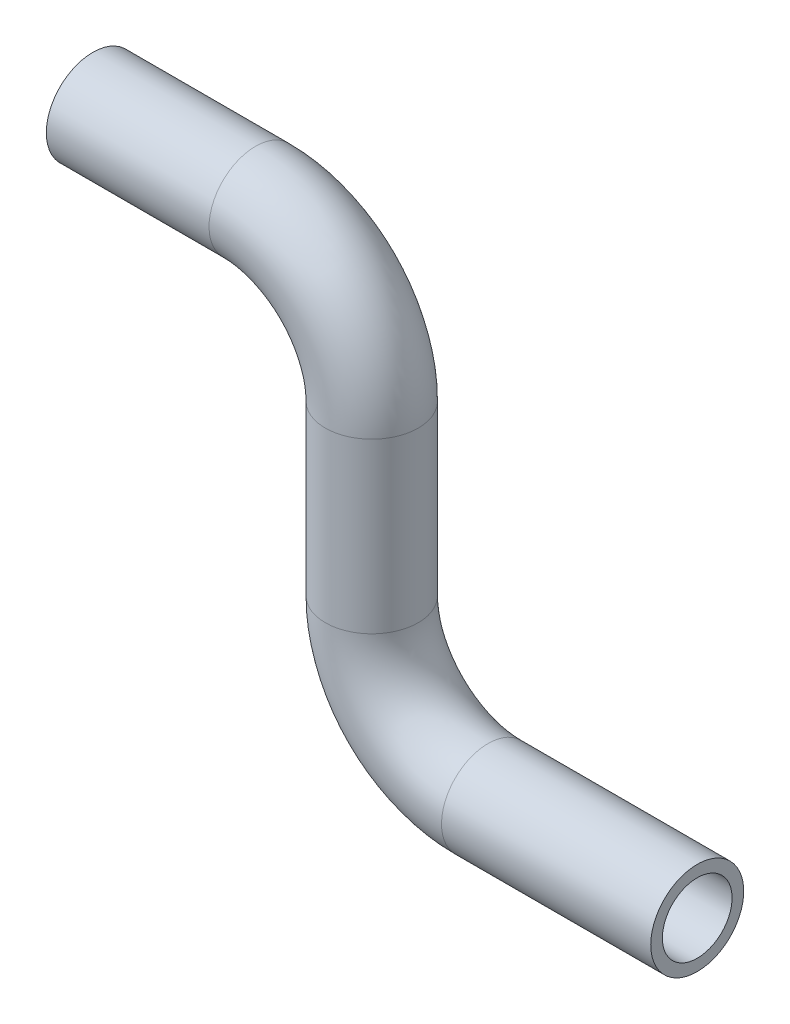
ISO-10303-21;
HEADER;
FILE_DESCRIPTION(('STEP AP214'),'2;1');
FILE_NAME('part.step','',(''),(''),'','','');
FILE_SCHEMA(('AUTOMOTIVE_DESIGN { 1 0 10303 214 1 1 1 1 }'));
ENDSEC;
DATA;
#1=APPLICATION_CONTEXT('core data for automotive mechanical design processes');
#2=APPLICATION_PROTOCOL_DEFINITION('international standard','automotive_design',2000,#1);
#3=PRODUCT_CONTEXT('',#1,'mechanical');
#4=PRODUCT('Part','Part','',(#3));
#5=PRODUCT_RELATED_PRODUCT_CATEGORY('part','',(#4));
#6=PRODUCT_DEFINITION_FORMATION('','',#4);
#7=PRODUCT_DEFINITION_CONTEXT('part definition',#1,'design');
#8=PRODUCT_DEFINITION('design','',#6,#7);
#9=PRODUCT_DEFINITION_SHAPE('','',#8);
#10=(LENGTH_UNIT() NAMED_UNIT(*) SI_UNIT(.MILLI.,.METRE.));
#11=(NAMED_UNIT(*) PLANE_ANGLE_UNIT() SI_UNIT($,.RADIAN.));
#12=(NAMED_UNIT(*) SI_UNIT($,.STERADIAN.) SOLID_ANGLE_UNIT());
#13=UNCERTAINTY_MEASURE_WITH_UNIT(LENGTH_MEASURE(1.E-05),#10,'distance_accuracy_value','');
#14=(GEOMETRIC_REPRESENTATION_CONTEXT(3) GLOBAL_UNCERTAINTY_ASSIGNED_CONTEXT((#13)) GLOBAL_UNIT_ASSIGNED_CONTEXT((#10,
#11,#12)) REPRESENTATION_CONTEXT('',''));
#15=CARTESIAN_POINT('',(0.,0.,0.));
#16=DIRECTION('',(0.,0.,1.));
#17=DIRECTION('',(1.,0.,0.));
#18=AXIS2_PLACEMENT_3D('',#15,#16,#17);
#19=CARTESIAN_POINT('',(28.,55.5,95.));
#20=DIRECTION('',(-1.,0.,0.));
#21=DIRECTION('',(0.,0.,1.));
#22=AXIS2_PLACEMENT_3D('',#19,#20,#21);
#23=PLANE('',#22);
#24=CARTESIAN_POINT('',(28.,55.5,95.));
#25=DIRECTION('',(-1.,0.,0.));
#26=DIRECTION('',(0.,0.,1.));
#27=AXIS2_PLACEMENT_3D('',#24,#25,#26);
#28=CIRCLE('',#27,3.);
#29=CARTESIAN_POINT('',(28.,55.5,98.));
#30=VERTEX_POINT('',#29);
#31=EDGE_CURVE('E213',#30,#30,#28,.T.);
#32=ORIENTED_EDGE('',*,*,#31,.F.);
#33=EDGE_LOOP('',(#32));
#34=FACE_BOUND('',#33,.T.);
#35=CARTESIAN_POINT('',(28.,55.5,95.));
#36=DIRECTION('',(-1.,0.,0.));
#37=DIRECTION('',(0.,0.,1.));
#38=AXIS2_PLACEMENT_3D('',#35,#36,#37);
#39=CIRCLE('',#38,4.);
#40=CARTESIAN_POINT('',(28.,55.5,99.));
#41=VERTEX_POINT('',#40);
#42=EDGE_CURVE('E75',#41,#41,#39,.T.);
#43=ORIENTED_EDGE('',*,*,#42,.T.);
#44=EDGE_LOOP('',(#43));
#45=FACE_BOUND('',#44,.T.);
#46=ADVANCED_FACE('F52',(#34,#45),#23,.T.);
#47=CARTESIAN_POINT('',(80.,21.,95.));
#48=DIRECTION('',(-1.,0.,0.));
#49=DIRECTION('',(0.,0.,1.));
#50=AXIS2_PLACEMENT_3D('',#47,#48,#49);
#51=PLANE('',#50);
#52=CARTESIAN_POINT('',(80.,21.,95.));
#53=DIRECTION('',(-1.,0.,0.));
#54=DIRECTION('',(0.,0.,1.));
#55=AXIS2_PLACEMENT_3D('',#52,#53,#54);
#56=CIRCLE('',#55,3.);
#57=CARTESIAN_POINT('',(80.,21.,98.));
#58=VERTEX_POINT('',#57);
#59=EDGE_CURVE('E73',#58,#58,#56,.T.);
#60=ORIENTED_EDGE('',*,*,#59,.T.);
#61=EDGE_LOOP('',(#60));
#62=FACE_BOUND('',#61,.T.);
#63=CARTESIAN_POINT('',(80.,21.,95.));
#64=DIRECTION('',(-1.,0.,0.));
#65=DIRECTION('',(0.,0.,1.));
#66=AXIS2_PLACEMENT_3D('',#63,#64,#65);
#67=CIRCLE('',#66,4.);
#68=CARTESIAN_POINT('',(80.,21.,99.));
#69=VERTEX_POINT('',#68);
#70=EDGE_CURVE('E11',#69,#69,#67,.T.);
#71=ORIENTED_EDGE('',*,*,#70,.F.);
#72=EDGE_LOOP('',(#71));
#73=FACE_BOUND('',#72,.T.);
#74=ADVANCED_FACE('F134',(#62,#73),#51,.F.);
#75=CARTESIAN_POINT('',(28.,55.5,95.));
#76=DIRECTION('',(1.,0.,0.));
#77=DIRECTION('',(0.,0.,-1.));
#78=AXIS2_PLACEMENT_3D('',#75,#76,#77);
#79=CYLINDRICAL_SURFACE('',#78,4.);
#80=CARTESIAN_POINT('',(42.,55.5,95.));
#81=DIRECTION('',(1.,0.,0.));
#82=DIRECTION('',(0.,0.,-1.));
#83=AXIS2_PLACEMENT_3D('',#80,#81,#82);
#84=CIRCLE('',#83,4.);
#85=CARTESIAN_POINT('',(42.,59.5,95.));
#86=VERTEX_POINT('',#85);
#87=EDGE_CURVE('E74',#86,#86,#84,.F.);
#88=ORIENTED_EDGE('',*,*,#87,.T.);
#89=EDGE_LOOP('',(#88));
#90=FACE_BOUND('',#89,.T.);
#91=ORIENTED_EDGE('',*,*,#42,.F.);
#92=EDGE_LOOP('',(#91));
#93=FACE_BOUND('',#92,.T.);
#94=ADVANCED_FACE('F102',(#90,#93),#79,.T.);
#95=CARTESIAN_POINT('',(42.,45.5,95.));
#96=DIRECTION('',(0.,0.,-1.));
#97=DIRECTION('',(-1.,0.,0.));
#98=AXIS2_PLACEMENT_3D('',#95,#96,#97);
#99=TOROIDAL_SURFACE('',#98,10.,4.);
#100=CARTESIAN_POINT('',(52.,45.5,95.));
#101=DIRECTION('',(0.,1.,0.));
#102=DIRECTION('',(-1.,0.,0.));
#103=AXIS2_PLACEMENT_3D('',#100,#101,#102);
#104=CIRCLE('',#103,4.);
#105=CARTESIAN_POINT('',(56.,45.5,95.));
#106=VERTEX_POINT('',#105);
#107=EDGE_CURVE('E67',#106,#106,#104,.T.);
#108=CARTESIAN_POINT('',(42.,45.5,95.));
#109=DIRECTION('',(0.,0.,-1.));
#110=DIRECTION('',(-1.,0.,0.));
#111=AXIS2_PLACEMENT_3D('',#108,#109,#110);
#112=CIRCLE('',#111,14.);
#113=EDGE_CURVE('',#86,#106,#112,.T.);
#114=ORIENTED_EDGE('',*,*,#87,.F.);
#115=ORIENTED_EDGE('',*,*,#107,.T.);
#116=ORIENTED_EDGE('',*,*,#113,.T.);
#117=ORIENTED_EDGE('',*,*,#113,.F.);
#118=EDGE_LOOP('',(#114,#116,#115,#117));
#119=FACE_BOUND('',#118,.T.);
#120=ADVANCED_FACE('F95',(#119),#99,.T.);
#121=CARTESIAN_POINT('',(52.,45.5,95.));
#122=DIRECTION('',(0.,-1.,0.));
#123=DIRECTION('',(0.,0.,-1.));
#124=AXIS2_PLACEMENT_3D('',#121,#122,#123);
#125=CYLINDRICAL_SURFACE('',#124,4.);
#126=CARTESIAN_POINT('',(52.,31.,95.));
#127=DIRECTION('',(0.,-1.,0.));
#128=DIRECTION('',(0.,0.,-1.));
#129=AXIS2_PLACEMENT_3D('',#126,#127,#128);
#130=CIRCLE('',#129,4.);
#131=CARTESIAN_POINT('',(48.,31.,95.));
#132=VERTEX_POINT('',#131);
#133=EDGE_CURVE('E63',#132,#132,#130,.F.);
#134=ORIENTED_EDGE('',*,*,#133,.T.);
#135=EDGE_LOOP('',(#134));
#136=FACE_BOUND('',#135,.T.);
#137=ORIENTED_EDGE('',*,*,#107,.F.);
#138=EDGE_LOOP('',(#137));
#139=FACE_BOUND('',#138,.T.);
#140=ADVANCED_FACE('F92',(#136,#139),#125,.T.);
#141=CARTESIAN_POINT('',(62.,31.,95.));
#142=DIRECTION('',(0.,0.,1.));
#143=DIRECTION('',(1.,0.,0.));
#144=AXIS2_PLACEMENT_3D('',#141,#142,#143);
#145=TOROIDAL_SURFACE('',#144,10.,4.);
#146=CARTESIAN_POINT('',(62.,21.,95.));
#147=DIRECTION('',(-1.,0.,0.));
#148=DIRECTION('',(0.,-1.,0.));
#149=AXIS2_PLACEMENT_3D('',#146,#147,#148);
#150=CIRCLE('',#149,4.);
#151=CARTESIAN_POINT('',(62.,17.,95.));
#152=VERTEX_POINT('',#151);
#153=EDGE_CURVE('E58',#152,#152,#150,.T.);
#154=CARTESIAN_POINT('',(62.,31.,95.));
#155=DIRECTION('',(0.,0.,1.));
#156=DIRECTION('',(1.,0.,0.));
#157=AXIS2_PLACEMENT_3D('',#154,#155,#156);
#158=CIRCLE('',#157,14.);
#159=EDGE_CURVE('',#132,#152,#158,.T.);
#160=ORIENTED_EDGE('',*,*,#133,.F.);
#161=ORIENTED_EDGE('',*,*,#153,.T.);
#162=ORIENTED_EDGE('',*,*,#159,.T.);
#163=ORIENTED_EDGE('',*,*,#159,.F.);
#164=EDGE_LOOP('',(#160,#162,#161,#163));
#165=FACE_BOUND('',#164,.T.);
#166=ADVANCED_FACE('F100',(#165),#145,.T.);
#167=CARTESIAN_POINT('',(62.,21.,95.));
#168=DIRECTION('',(1.,0.,0.));
#169=DIRECTION('',(0.,0.,-1.));
#170=AXIS2_PLACEMENT_3D('',#167,#168,#169);
#171=CYLINDRICAL_SURFACE('',#170,4.);
#172=ORIENTED_EDGE('',*,*,#70,.T.);
#173=EDGE_LOOP('',(#172));
#174=FACE_BOUND('',#173,.T.);
#175=ORIENTED_EDGE('',*,*,#153,.F.);
#176=EDGE_LOOP('',(#175));
#177=FACE_BOUND('',#176,.T.);
#178=ADVANCED_FACE('F54',(#174,#177),#171,.T.);
#179=CARTESIAN_POINT('',(28.,55.5,95.));
#180=DIRECTION('',(1.,0.,0.));
#181=DIRECTION('',(0.,0.,-1.));
#182=AXIS2_PLACEMENT_3D('',#179,#180,#181);
#183=CYLINDRICAL_SURFACE('',#182,3.);
#184=CARTESIAN_POINT('',(42.,55.5,95.));
#185=DIRECTION('',(-1.,0.,0.));
#186=DIRECTION('',(0.,0.,1.));
#187=AXIS2_PLACEMENT_3D('',#184,#185,#186);
#188=CIRCLE('',#187,3.);
#189=CARTESIAN_POINT('',(42.,58.5,95.));
#190=VERTEX_POINT('',#189);
#191=EDGE_CURVE('E212',#190,#190,#188,.T.);
#192=ORIENTED_EDGE('',*,*,#191,.F.);
#193=EDGE_LOOP('',(#192));
#194=FACE_BOUND('',#193,.T.);
#195=ORIENTED_EDGE('',*,*,#31,.T.);
#196=EDGE_LOOP('',(#195));
#197=FACE_BOUND('',#196,.T.);
#198=ADVANCED_FACE('F110',(#194,#197),#183,.F.);
#199=CARTESIAN_POINT('',(42.,45.5,95.));
#200=DIRECTION('',(0.,0.,-1.));
#201=DIRECTION('',(-1.,0.,0.));
#202=AXIS2_PLACEMENT_3D('',#199,#200,#201);
#203=TOROIDAL_SURFACE('',#202,10.,3.);
#204=CARTESIAN_POINT('',(52.,45.5,95.));
#205=DIRECTION('',(0.,1.,0.));
#206=DIRECTION('',(0.,0.,1.));
#207=AXIS2_PLACEMENT_3D('',#204,#205,#206);
#208=CIRCLE('',#207,3.);
#209=CARTESIAN_POINT('',(55.,45.5,95.));
#210=VERTEX_POINT('',#209);
#211=EDGE_CURVE('E220',#210,#210,#208,.T.);
#212=CARTESIAN_POINT('',(42.,45.5,95.));
#213=DIRECTION('',(0.,0.,-1.));
#214=DIRECTION('',(-1.,0.,0.));
#215=AXIS2_PLACEMENT_3D('',#212,#213,#214);
#216=CIRCLE('',#215,13.);
#217=EDGE_CURVE('',#190,#210,#216,.T.);
#218=ORIENTED_EDGE('',*,*,#191,.T.);
#219=ORIENTED_EDGE('',*,*,#211,.F.);
#220=ORIENTED_EDGE('',*,*,#217,.T.);
#221=ORIENTED_EDGE('',*,*,#217,.F.);
#222=EDGE_LOOP('',(#218,#220,#219,#221));
#223=FACE_BOUND('',#222,.T.);
#224=ADVANCED_FACE('F112',(#223),#203,.F.);
#225=CARTESIAN_POINT('',(52.,45.5,95.));
#226=DIRECTION('',(0.,-1.,0.));
#227=DIRECTION('',(0.,0.,-1.));
#228=AXIS2_PLACEMENT_3D('',#225,#226,#227);
#229=CYLINDRICAL_SURFACE('',#228,3.);
#230=CARTESIAN_POINT('',(52.,31.,95.));
#231=DIRECTION('',(0.,1.,0.));
#232=DIRECTION('',(0.,0.,1.));
#233=AXIS2_PLACEMENT_3D('',#230,#231,#232);
#234=CIRCLE('',#233,3.);
#235=CARTESIAN_POINT('',(49.,31.,95.));
#236=VERTEX_POINT('',#235);
#237=EDGE_CURVE('E88',#236,#236,#234,.T.);
#238=ORIENTED_EDGE('',*,*,#237,.F.);
#239=EDGE_LOOP('',(#238));
#240=FACE_BOUND('',#239,.T.);
#241=ORIENTED_EDGE('',*,*,#211,.T.);
#242=EDGE_LOOP('',(#241));
#243=FACE_BOUND('',#242,.T.);
#244=ADVANCED_FACE('F117',(#240,#243),#229,.F.);
#245=CARTESIAN_POINT('',(62.,31.,95.));
#246=DIRECTION('',(0.,0.,1.));
#247=DIRECTION('',(1.,0.,0.));
#248=AXIS2_PLACEMENT_3D('',#245,#246,#247);
#249=TOROIDAL_SURFACE('',#248,10.,3.);
#250=CARTESIAN_POINT('',(62.,21.,95.));
#251=DIRECTION('',(-1.,0.,0.));
#252=DIRECTION('',(0.,0.,1.));
#253=AXIS2_PLACEMENT_3D('',#250,#251,#252);
#254=CIRCLE('',#253,3.);
#255=CARTESIAN_POINT('',(62.,18.,95.));
#256=VERTEX_POINT('',#255);
#257=EDGE_CURVE('E81',#256,#256,#254,.T.);
#258=CARTESIAN_POINT('',(62.,31.,95.));
#259=DIRECTION('',(0.,0.,1.));
#260=DIRECTION('',(1.,0.,0.));
#261=AXIS2_PLACEMENT_3D('',#258,#259,#260);
#262=CIRCLE('',#261,13.);
#263=EDGE_CURVE('',#236,#256,#262,.T.);
#264=ORIENTED_EDGE('',*,*,#237,.T.);
#265=ORIENTED_EDGE('',*,*,#257,.F.);
#266=ORIENTED_EDGE('',*,*,#263,.T.);
#267=ORIENTED_EDGE('',*,*,#263,.F.);
#268=EDGE_LOOP('',(#264,#266,#265,#267));
#269=FACE_BOUND('',#268,.T.);
#270=ADVANCED_FACE('F127',(#269),#249,.F.);
#271=CARTESIAN_POINT('',(62.,21.,95.));
#272=DIRECTION('',(1.,0.,0.));
#273=DIRECTION('',(0.,0.,-1.));
#274=AXIS2_PLACEMENT_3D('',#271,#272,#273);
#275=CYLINDRICAL_SURFACE('',#274,3.);
#276=ORIENTED_EDGE('',*,*,#59,.F.);
#277=EDGE_LOOP('',(#276));
#278=FACE_BOUND('',#277,.T.);
#279=ORIENTED_EDGE('',*,*,#257,.T.);
#280=EDGE_LOOP('',(#279));
#281=FACE_BOUND('',#280,.T.);
#282=ADVANCED_FACE('F128',(#278,#281),#275,.F.);
#283=CLOSED_SHELL('',(#46,#74,#94,#120,#140,#166,#178,#198,#224,#244,#270,#282));
#284=MANIFOLD_SOLID_BREP('B2',#283);
#285=ADVANCED_BREP_SHAPE_REPRESENTATION('',(#18,#284),#14);
#286=SHAPE_DEFINITION_REPRESENTATION(#9,#285);
ENDSEC;
END-ISO-10303-21;
